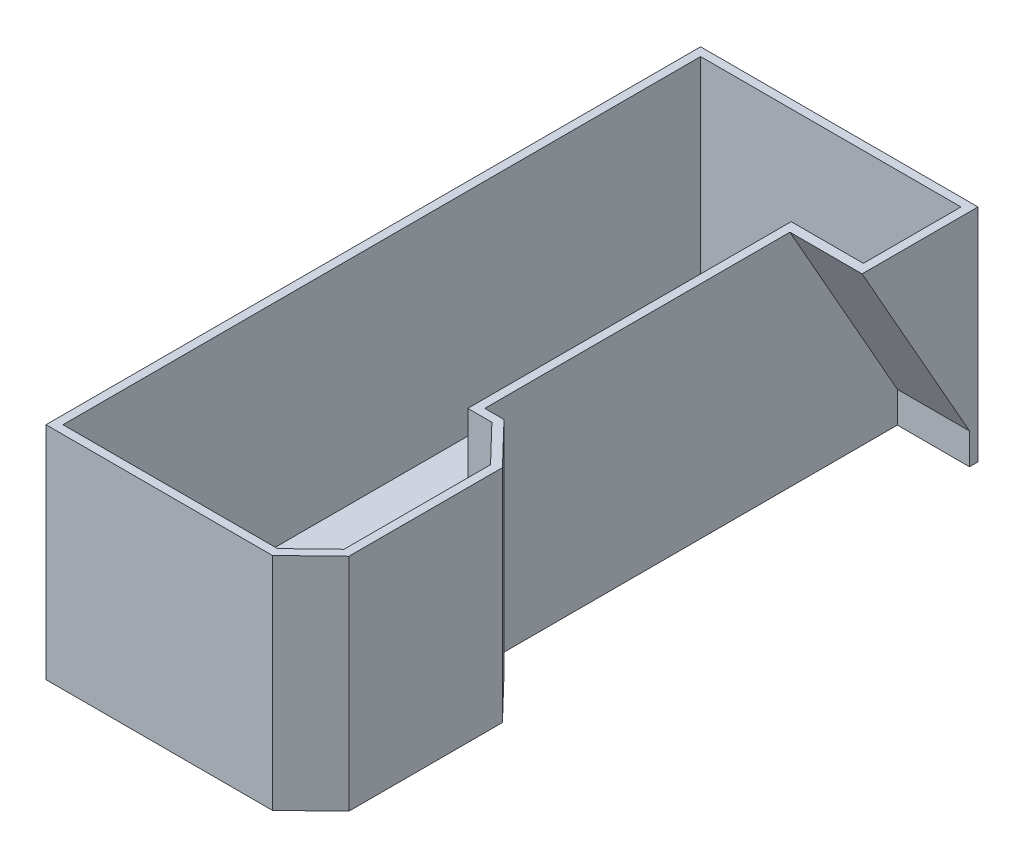
ISO-10303-21;
HEADER;
FILE_DESCRIPTION(('STEP AP214'),'2;1');
FILE_NAME('part.step','',(''),(''),'','','');
FILE_SCHEMA(('AUTOMOTIVE_DESIGN { 1 0 10303 214 1 1 1 1 }'));
ENDSEC;
DATA;
#1=APPLICATION_CONTEXT('core data for automotive mechanical design processes');
#2=APPLICATION_PROTOCOL_DEFINITION('international standard','automotive_design',2000,#1);
#3=PRODUCT_CONTEXT('',#1,'mechanical');
#4=PRODUCT('Part','Part','',(#3));
#5=PRODUCT_RELATED_PRODUCT_CATEGORY('part','',(#4));
#6=PRODUCT_DEFINITION_FORMATION('','',#4);
#7=PRODUCT_DEFINITION_CONTEXT('part definition',#1,'design');
#8=PRODUCT_DEFINITION('design','',#6,#7);
#9=PRODUCT_DEFINITION_SHAPE('','',#8);
#10=(LENGTH_UNIT() NAMED_UNIT(*) SI_UNIT(.MILLI.,.METRE.));
#11=(NAMED_UNIT(*) PLANE_ANGLE_UNIT() SI_UNIT($,.RADIAN.));
#12=(NAMED_UNIT(*) SI_UNIT($,.STERADIAN.) SOLID_ANGLE_UNIT());
#13=UNCERTAINTY_MEASURE_WITH_UNIT(LENGTH_MEASURE(1.E-05),#10,'distance_accuracy_value','');
#14=(GEOMETRIC_REPRESENTATION_CONTEXT(3) GLOBAL_UNCERTAINTY_ASSIGNED_CONTEXT((#13)) GLOBAL_UNIT_ASSIGNED_CONTEXT((#10,
#11,#12)) REPRESENTATION_CONTEXT('',''));
#15=CARTESIAN_POINT('',(0.,0.,0.));
#16=DIRECTION('',(0.,0.,1.));
#17=DIRECTION('',(1.,0.,0.));
#18=AXIS2_PLACEMENT_3D('',#15,#16,#17);
#19=CARTESIAN_POINT('',(290.,12.,0.));
#20=DIRECTION('',(-1.,0.,0.));
#21=DIRECTION('',(0.,0.,1.));
#22=AXIS2_PLACEMENT_3D('',#19,#20,#21);
#23=PLANE('',#22);
#24=DIRECTION('',(0.,-1.,0.));
#25=VECTOR('',#24,1.);
#26=CARTESIAN_POINT('',(290.,43.8393760342638,-913.));
#27=LINE('',#26,#25);
#28=CARTESIAN_POINT('',(290.,43.8393760342638,-913.));
#29=VERTEX_POINT('',#28);
#30=CARTESIAN_POINT('',(290.,0.,-913.));
#31=VERTEX_POINT('',#30);
#32=EDGE_CURVE('E189',#29,#31,#27,.T.);
#33=ORIENTED_EDGE('',*,*,#32,.F.);
#34=DIRECTION('',(0.,-0.87025685507146,-0.49259821985177));
#35=VECTOR('',#34,1.);
#36=CARTESIAN_POINT('',(290.,22.6393760342639,-925.));
#37=LINE('',#36,#35);
#38=CARTESIAN_POINT('',(290.,312.,-761.210967566564));
#39=VERTEX_POINT('',#38);
#40=EDGE_CURVE('E201',#39,#29,#37,.T.);
#41=ORIENTED_EDGE('',*,*,#40,.F.);
#42=DIRECTION('',(0.,0.,-1.));
#43=VECTOR('',#42,1.);
#44=CARTESIAN_POINT('',(290.,312.,-330.));
#45=LINE('',#44,#43);
#46=CARTESIAN_POINT('',(290.,312.,-330.));
#47=VERTEX_POINT('',#46);
#48=EDGE_CURVE('E298',#47,#39,#45,.T.);
#49=ORIENTED_EDGE('',*,*,#48,.F.);
#50=DIRECTION('',(0.,1.,0.));
#51=VECTOR('',#50,1.);
#52=CARTESIAN_POINT('',(290.,0.,-330.));
#53=LINE('',#52,#51);
#54=CARTESIAN_POINT('',(290.,0.,-330.));
#55=VERTEX_POINT('',#54);
#56=EDGE_CURVE('E313',#55,#47,#53,.T.);
#57=ORIENTED_EDGE('',*,*,#56,.F.);
#58=DIRECTION('',(0.,0.,-1.));
#59=VECTOR('',#58,1.);
#60=CARTESIAN_POINT('',(290.,0.,0.));
#61=LINE('',#60,#59);
#62=EDGE_CURVE('E204',#55,#31,#61,.T.);
#63=ORIENTED_EDGE('',*,*,#62,.T.);
#64=EDGE_LOOP('',(#33,#41,#49,#57,#63));
#65=FACE_BOUND('',#64,.T.);
#66=ADVANCED_FACE('F40',(#65),#23,.F.);
#67=CARTESIAN_POINT('',(380.,22.6393760342639,-925.));
#68=DIRECTION('',(0.,0.49259821985177,-0.87025685507146));
#69=DIRECTION('',(0.,0.87025685507146,0.49259821985177));
#70=AXIS2_PLACEMENT_3D('',#67,#68,#69);
#71=PLANE('',#70);
#72=DIRECTION('',(-1.,0.,0.));
#73=VECTOR('',#72,1.);
#74=CARTESIAN_POINT('',(437.45207246181,43.8393760342638,-913.));
#75=LINE('',#74,#73);
#76=CARTESIAN_POINT('',(392.,43.8393760342638,-913.));
#77=VERTEX_POINT('',#76);
#78=EDGE_CURVE('E185',#77,#29,#75,.T.);
#79=ORIENTED_EDGE('',*,*,#78,.F.);
#80=DIRECTION('',(0.,-0.87025685507146,-0.49259821985177));
#81=VECTOR('',#80,1.);
#82=CARTESIAN_POINT('',(392.,22.6393760342638,-925.));
#83=LINE('',#82,#81);
#84=CARTESIAN_POINT('',(392.,312.,-761.210967566564));
#85=VERTEX_POINT('',#84);
#86=EDGE_CURVE('E359',#85,#77,#83,.T.);
#87=ORIENTED_EDGE('',*,*,#86,.F.);
#88=DIRECTION('',(-1.,0.,0.));
#89=VECTOR('',#88,1.);
#90=CARTESIAN_POINT('',(380.,312.,-761.210967566564));
#91=LINE('',#90,#89);
#92=EDGE_CURVE('E207',#85,#39,#91,.T.);
#93=ORIENTED_EDGE('',*,*,#92,.T.);
#94=ORIENTED_EDGE('',*,*,#40,.T.);
#95=EDGE_LOOP('',(#79,#87,#93,#94));
#96=FACE_BOUND('',#95,.T.);
#97=ADVANCED_FACE('F206',(#96),#71,.F.);
#98=CARTESIAN_POINT('',(278.,312.,-775.));
#99=DIRECTION('',(0.,-0.49259821985177,0.87025685507146));
#100=DIRECTION('',(0.,-0.87025685507146,-0.49259821985177));
#101=AXIS2_PLACEMENT_3D('',#98,#99,#100);
#102=PLANE('',#101);
#103=DIRECTION('',(-1.,0.,0.));
#104=VECTOR('',#103,1.);
#105=CARTESIAN_POINT('',(380.,68.2,-913.));
#106=LINE('',#105,#104);
#107=CARTESIAN_POINT('',(380.,68.2,-913.));
#108=VERTEX_POINT('',#107);
#109=CARTESIAN_POINT('',(278.,68.2,-913.));
#110=VERTEX_POINT('',#109);
#111=EDGE_CURVE('E55',#108,#110,#106,.T.);
#112=ORIENTED_EDGE('',*,*,#111,.T.);
#113=DIRECTION('',(0.,-0.87025685507146,-0.49259821985177));
#114=VECTOR('',#113,1.);
#115=CARTESIAN_POINT('',(278.,312.,-775.));
#116=LINE('',#115,#114);
#117=CARTESIAN_POINT('',(278.,312.,-775.));
#118=VERTEX_POINT('',#117);
#119=EDGE_CURVE('E216',#118,#110,#116,.T.);
#120=ORIENTED_EDGE('',*,*,#119,.F.);
#121=DIRECTION('',(1.,0.,0.));
#122=VECTOR('',#121,1.);
#123=CARTESIAN_POINT('',(278.,312.,-775.));
#124=LINE('',#123,#122);
#125=CARTESIAN_POINT('',(380.,312.,-775.));
#126=VERTEX_POINT('',#125);
#127=EDGE_CURVE('E218',#118,#126,#124,.T.);
#128=ORIENTED_EDGE('',*,*,#127,.T.);
#129=DIRECTION('',(0.,0.87025685507146,0.49259821985177));
#130=VECTOR('',#129,1.);
#131=CARTESIAN_POINT('',(380.,312.,-775.));
#132=LINE('',#131,#130);
#133=EDGE_CURVE('E208',#108,#126,#132,.T.);
#134=ORIENTED_EDGE('',*,*,#133,.F.);
#135=EDGE_LOOP('',(#112,#120,#128,#134));
#136=FACE_BOUND('',#135,.T.);
#137=ADVANCED_FACE('F402',(#136),#102,.F.);
#138=CARTESIAN_POINT('',(0.,12.,0.));
#139=DIRECTION('',(1.,0.,0.));
#140=DIRECTION('',(0.,0.,-1.));
#141=AXIS2_PLACEMENT_3D('',#138,#139,#140);
#142=PLANE('',#141);
#143=DIRECTION('',(0.,0.,1.));
#144=VECTOR('',#143,1.);
#145=CARTESIAN_POINT('',(0.,0.,0.));
#146=LINE('',#145,#144);
#147=CARTESIAN_POINT('',(0.,0.,-925.));
#148=VERTEX_POINT('',#147);
#149=CARTESIAN_POINT('',(0.,0.,0.));
#150=VERTEX_POINT('',#149);
#151=EDGE_CURVE('E315',#148,#150,#146,.T.);
#152=ORIENTED_EDGE('',*,*,#151,.T.);
#153=DIRECTION('',(0.,-1.,0.));
#154=VECTOR('',#153,1.);
#155=CARTESIAN_POINT('',(0.,12.,0.));
#156=LINE('',#155,#154);
#157=CARTESIAN_POINT('',(0.,312.,0.));
#158=VERTEX_POINT('',#157);
#159=EDGE_CURVE('E11',#158,#150,#156,.T.);
#160=ORIENTED_EDGE('',*,*,#159,.F.);
#161=DIRECTION('',(0.,0.,1.));
#162=VECTOR('',#161,1.);
#163=CARTESIAN_POINT('',(0.,312.,-925.));
#164=LINE('',#163,#162);
#165=CARTESIAN_POINT('',(0.,312.,-925.));
#166=VERTEX_POINT('',#165);
#167=EDGE_CURVE('E280',#166,#158,#164,.T.);
#168=ORIENTED_EDGE('',*,*,#167,.F.);
#169=DIRECTION('',(0.,-1.,0.));
#170=VECTOR('',#169,1.);
#171=CARTESIAN_POINT('',(0.,12.,-925.));
#172=LINE('',#171,#170);
#173=EDGE_CURVE('E48',#166,#148,#172,.T.);
#174=ORIENTED_EDGE('',*,*,#173,.T.);
#175=EDGE_LOOP('',(#152,#160,#168,#174));
#176=FACE_BOUND('',#175,.T.);
#177=ADVANCED_FACE('F42',(#176),#142,.F.);
#178=CARTESIAN_POINT('',(0.,12.,0.));
#179=DIRECTION('',(0.,0.,-1.));
#180=DIRECTION('',(-1.,0.,0.));
#181=AXIS2_PLACEMENT_3D('',#178,#179,#180);
#182=PLANE('',#181);
#183=DIRECTION('',(1.,0.,0.));
#184=VECTOR('',#183,1.);
#185=CARTESIAN_POINT('',(0.,0.,0.));
#186=LINE('',#185,#184);
#187=CARTESIAN_POINT('',(320.,0.,0.));
#188=VERTEX_POINT('',#187);
#189=EDGE_CURVE('E325',#150,#188,#186,.T.);
#190=ORIENTED_EDGE('',*,*,#189,.T.);
#191=DIRECTION('',(0.,1.,0.));
#192=VECTOR('',#191,1.);
#193=CARTESIAN_POINT('',(320.,0.,0.));
#194=LINE('',#193,#192);
#195=CARTESIAN_POINT('',(320.,312.,0.));
#196=VERTEX_POINT('',#195);
#197=EDGE_CURVE('E312',#188,#196,#194,.T.);
#198=ORIENTED_EDGE('',*,*,#197,.T.);
#199=DIRECTION('',(1.,0.,0.));
#200=VECTOR('',#199,1.);
#201=CARTESIAN_POINT('',(0.,312.,0.));
#202=LINE('',#201,#200);
#203=EDGE_CURVE('E283',#158,#196,#202,.T.);
#204=ORIENTED_EDGE('',*,*,#203,.F.);
#205=ORIENTED_EDGE('',*,*,#159,.T.);
#206=EDGE_LOOP('',(#190,#198,#204,#205));
#207=FACE_BOUND('',#206,.T.);
#208=ADVANCED_FACE('F344',(#207),#182,.F.);
#209=CARTESIAN_POINT('',(0.,12.,-925.));
#210=DIRECTION('',(0.,0.,1.));
#211=DIRECTION('',(1.,0.,0.));
#212=AXIS2_PLACEMENT_3D('',#209,#210,#211);
#213=PLANE('',#212);
#214=DIRECTION('',(0.,1.,0.));
#215=VECTOR('',#214,1.);
#216=CARTESIAN_POINT('',(392.,312.,-925.));
#217=LINE('',#216,#215);
#218=CARTESIAN_POINT('',(392.,0.,-925.));
#219=VERTEX_POINT('',#218);
#220=CARTESIAN_POINT('',(392.,312.,-925.));
#221=VERTEX_POINT('',#220);
#222=EDGE_CURVE('E354',#219,#221,#217,.T.);
#223=ORIENTED_EDGE('',*,*,#222,.F.);
#224=DIRECTION('',(-1.,0.,0.));
#225=VECTOR('',#224,1.);
#226=CARTESIAN_POINT('',(0.,0.,-925.));
#227=LINE('',#226,#225);
#228=EDGE_CURVE('E328',#219,#148,#227,.T.);
#229=ORIENTED_EDGE('',*,*,#228,.T.);
#230=ORIENTED_EDGE('',*,*,#173,.F.);
#231=DIRECTION('',(-1.,0.,0.));
#232=VECTOR('',#231,1.);
#233=CARTESIAN_POINT('',(290.,312.,-925.));
#234=LINE('',#233,#232);
#235=EDGE_CURVE('E278',#221,#166,#234,.T.);
#236=ORIENTED_EDGE('',*,*,#235,.F.);
#237=EDGE_LOOP('',(#223,#229,#230,#236));
#238=FACE_BOUND('',#237,.T.);
#239=ADVANCED_FACE('F353',(#238),#213,.F.);
#240=CARTESIAN_POINT('',(0.,0.,0.));
#241=DIRECTION('',(0.,-1.,0.));
#242=DIRECTION('',(0.,0.,-1.));
#243=AXIS2_PLACEMENT_3D('',#240,#241,#242);
#244=PLANE('',#243);
#245=ORIENTED_EDGE('',*,*,#151,.F.);
#246=ORIENTED_EDGE('',*,*,#228,.F.);
#247=DIRECTION('',(0.,0.,1.));
#248=VECTOR('',#247,1.);
#249=CARTESIAN_POINT('',(392.,0.,-913.));
#250=LINE('',#249,#248);
#251=CARTESIAN_POINT('',(392.,0.,-913.));
#252=VERTEX_POINT('',#251);
#253=EDGE_CURVE('E358',#219,#252,#250,.T.);
#254=ORIENTED_EDGE('',*,*,#253,.T.);
#255=DIRECTION('',(-1.,0.,0.));
#256=VECTOR('',#255,1.);
#257=CARTESIAN_POINT('',(437.45207246181,0.,-913.));
#258=LINE('',#257,#256);
#259=EDGE_CURVE('E196',#252,#31,#258,.T.);
#260=ORIENTED_EDGE('',*,*,#259,.T.);
#261=ORIENTED_EDGE('',*,*,#62,.F.);
#262=DIRECTION('',(-1.,0.,0.));
#263=VECTOR('',#262,1.);
#264=CARTESIAN_POINT('',(290.,0.,-330.));
#265=LINE('',#264,#263);
#266=CARTESIAN_POINT('',(317.181818181818,0.,-330.));
#267=VERTEX_POINT('',#266);
#268=EDGE_CURVE('E309',#267,#55,#265,.T.);
#269=ORIENTED_EDGE('',*,*,#268,.F.);
#270=DIRECTION('',(-0.693893241040933,0.,-0.720077891646251));
#271=VECTOR('',#270,1.);
#272=CARTESIAN_POINT('',(317.181818181818,0.,-330.));
#273=LINE('',#272,#271);
#274=CARTESIAN_POINT('',(375.,0.,-270.));
#275=VERTEX_POINT('',#274);
#276=EDGE_CURVE('E306',#275,#267,#273,.T.);
#277=ORIENTED_EDGE('',*,*,#276,.F.);
#278=DIRECTION('',(0.,0.,-1.));
#279=VECTOR('',#278,1.);
#280=CARTESIAN_POINT('',(375.,0.,-270.));
#281=LINE('',#280,#279);
#282=CARTESIAN_POINT('',(375.,0.,-53.));
#283=VERTEX_POINT('',#282);
#284=EDGE_CURVE('E303',#283,#275,#281,.T.);
#285=ORIENTED_EDGE('',*,*,#284,.F.);
#286=DIRECTION('',(0.720077891646251,0.,-0.693893241040933));
#287=VECTOR('',#286,1.);
#288=CARTESIAN_POINT('',(375.,0.,-53.));
#289=LINE('',#288,#287);
#290=EDGE_CURVE('E300',#188,#283,#289,.T.);
#291=ORIENTED_EDGE('',*,*,#290,.F.);
#292=ORIENTED_EDGE('',*,*,#189,.F.);
#293=EDGE_LOOP('',(#245,#246,#254,#260,#261,#269,#277,#285,#291,#292));
#294=FACE_BOUND('',#293,.T.);
#295=ADVANCED_FACE('F336',(#294),#244,.T.);
#296=CARTESIAN_POINT('',(290.,0.,-330.));
#297=DIRECTION('',(0.,0.,-1.));
#298=DIRECTION('',(-1.,0.,0.));
#299=AXIS2_PLACEMENT_3D('',#296,#297,#298);
#300=PLANE('',#299);
#301=ORIENTED_EDGE('',*,*,#56,.T.);
#302=DIRECTION('',(-1.,0.,0.));
#303=VECTOR('',#302,1.);
#304=CARTESIAN_POINT('',(317.181818181818,312.,-330.));
#305=LINE('',#304,#303);
#306=CARTESIAN_POINT('',(317.181818181818,312.,-330.));
#307=VERTEX_POINT('',#306);
#308=EDGE_CURVE('E295',#307,#47,#305,.T.);
#309=ORIENTED_EDGE('',*,*,#308,.F.);
#310=DIRECTION('',(0.,1.,0.));
#311=VECTOR('',#310,1.);
#312=CARTESIAN_POINT('',(317.181818181818,0.,-330.));
#313=LINE('',#312,#311);
#314=EDGE_CURVE('E316',#267,#307,#313,.T.);
#315=ORIENTED_EDGE('',*,*,#314,.F.);
#316=ORIENTED_EDGE('',*,*,#268,.T.);
#317=EDGE_LOOP('',(#301,#309,#315,#316));
#318=FACE_BOUND('',#317,.T.);
#319=ADVANCED_FACE('F428',(#318),#300,.T.);
#320=CARTESIAN_POINT('',(317.181818181818,0.,-330.));
#321=DIRECTION('',(0.720077891646251,0.,-0.693893241040933));
#322=DIRECTION('',(-0.693893241040933,0.,-0.720077891646251));
#323=AXIS2_PLACEMENT_3D('',#320,#321,#322);
#324=PLANE('',#323);
#325=ORIENTED_EDGE('',*,*,#314,.T.);
#326=DIRECTION('',(-0.693893241040933,0.,-0.720077891646251));
#327=VECTOR('',#326,1.);
#328=CARTESIAN_POINT('',(375.,312.,-270.));
#329=LINE('',#328,#327);
#330=CARTESIAN_POINT('',(375.,312.,-270.));
#331=VERTEX_POINT('',#330);
#332=EDGE_CURVE('E292',#331,#307,#329,.T.);
#333=ORIENTED_EDGE('',*,*,#332,.F.);
#334=DIRECTION('',(0.,1.,0.));
#335=VECTOR('',#334,1.);
#336=CARTESIAN_POINT('',(375.,0.,-270.));
#337=LINE('',#336,#335);
#338=EDGE_CURVE('E318',#275,#331,#337,.T.);
#339=ORIENTED_EDGE('',*,*,#338,.F.);
#340=ORIENTED_EDGE('',*,*,#276,.T.);
#341=EDGE_LOOP('',(#325,#333,#339,#340));
#342=FACE_BOUND('',#341,.T.);
#343=ADVANCED_FACE('F432',(#342),#324,.T.);
#344=CARTESIAN_POINT('',(375.,0.,-270.));
#345=DIRECTION('',(1.,0.,0.));
#346=DIRECTION('',(0.,0.,-1.));
#347=AXIS2_PLACEMENT_3D('',#344,#345,#346);
#348=PLANE('',#347);
#349=ORIENTED_EDGE('',*,*,#338,.T.);
#350=DIRECTION('',(0.,0.,-1.));
#351=VECTOR('',#350,1.);
#352=CARTESIAN_POINT('',(375.,312.,-53.));
#353=LINE('',#352,#351);
#354=CARTESIAN_POINT('',(375.,312.,-53.));
#355=VERTEX_POINT('',#354);
#356=EDGE_CURVE('E289',#355,#331,#353,.T.);
#357=ORIENTED_EDGE('',*,*,#356,.F.);
#358=DIRECTION('',(0.,1.,0.));
#359=VECTOR('',#358,1.);
#360=CARTESIAN_POINT('',(375.,0.,-53.));
#361=LINE('',#360,#359);
#362=EDGE_CURVE('E320',#283,#355,#361,.T.);
#363=ORIENTED_EDGE('',*,*,#362,.F.);
#364=ORIENTED_EDGE('',*,*,#284,.T.);
#365=EDGE_LOOP('',(#349,#357,#363,#364));
#366=FACE_BOUND('',#365,.T.);
#367=ADVANCED_FACE('F441',(#366),#348,.T.);
#368=CARTESIAN_POINT('',(375.,0.,-53.));
#369=DIRECTION('',(0.693893241040933,0.,0.720077891646251));
#370=DIRECTION('',(0.720077891646251,0.,-0.693893241040933));
#371=AXIS2_PLACEMENT_3D('',#368,#369,#370);
#372=PLANE('',#371);
#373=ORIENTED_EDGE('',*,*,#362,.T.);
#374=DIRECTION('',(0.720077891646251,0.,-0.693893241040933));
#375=VECTOR('',#374,1.);
#376=CARTESIAN_POINT('',(320.,312.,0.));
#377=LINE('',#376,#375);
#378=EDGE_CURVE('E286',#196,#355,#377,.T.);
#379=ORIENTED_EDGE('',*,*,#378,.F.);
#380=ORIENTED_EDGE('',*,*,#197,.F.);
#381=ORIENTED_EDGE('',*,*,#290,.T.);
#382=EDGE_LOOP('',(#373,#379,#380,#381));
#383=FACE_BOUND('',#382,.T.);
#384=ADVANCED_FACE('F438',(#383),#372,.T.);
#385=CARTESIAN_POINT('',(0.,312.,0.));
#386=DIRECTION('',(0.,1.,0.));
#387=DIRECTION('',(0.,0.,1.));
#388=AXIS2_PLACEMENT_3D('',#385,#386,#387);
#389=PLANE('',#388);
#390=ORIENTED_EDGE('',*,*,#92,.F.);
#391=DIRECTION('',(0.,0.,1.));
#392=VECTOR('',#391,1.);
#393=CARTESIAN_POINT('',(392.,312.,-761.210967566564));
#394=LINE('',#393,#392);
#395=EDGE_CURVE('E351',#221,#85,#394,.T.);
#396=ORIENTED_EDGE('',*,*,#395,.F.);
#397=ORIENTED_EDGE('',*,*,#235,.T.);
#398=ORIENTED_EDGE('',*,*,#167,.T.);
#399=ORIENTED_EDGE('',*,*,#203,.T.);
#400=ORIENTED_EDGE('',*,*,#378,.T.);
#401=ORIENTED_EDGE('',*,*,#356,.T.);
#402=ORIENTED_EDGE('',*,*,#332,.T.);
#403=ORIENTED_EDGE('',*,*,#308,.T.);
#404=ORIENTED_EDGE('',*,*,#48,.T.);
#405=EDGE_LOOP('',(#390,#396,#397,#398,#399,#400,#401,#402,#403,#404));
#406=FACE_BOUND('',#405,.T.);
#407=ORIENTED_EDGE('',*,*,#127,.F.);
#408=DIRECTION('',(0.,0.,-1.));
#409=VECTOR('',#408,1.);
#410=CARTESIAN_POINT('',(278.,312.,-318.));
#411=LINE('',#410,#409);
#412=CARTESIAN_POINT('',(278.,312.,-318.));
#413=VERTEX_POINT('',#412);
#414=EDGE_CURVE('E237',#413,#118,#411,.T.);
#415=ORIENTED_EDGE('',*,*,#414,.F.);
#416=DIRECTION('',(-1.,0.,0.));
#417=VECTOR('',#416,1.);
#418=CARTESIAN_POINT('',(312.080590731117,312.,-318.));
#419=LINE('',#418,#417);
#420=CARTESIAN_POINT('',(312.080590731117,312.,-318.));
#421=VERTEX_POINT('',#420);
#422=EDGE_CURVE('E234',#421,#413,#419,.T.);
#423=ORIENTED_EDGE('',*,*,#422,.F.);
#424=DIRECTION('',(-0.693893241040933,0.,-0.720077891646251));
#425=VECTOR('',#424,1.);
#426=CARTESIAN_POINT('',(363.,312.,-265.159103588895));
#427=LINE('',#426,#425);
#428=CARTESIAN_POINT('',(363.,312.,-265.159103588895));
#429=VERTEX_POINT('',#428);
#430=EDGE_CURVE('E232',#429,#421,#427,.T.);
#431=ORIENTED_EDGE('',*,*,#430,.F.);
#432=DIRECTION('',(0.,0.,-1.));
#433=VECTOR('',#432,1.);
#434=CARTESIAN_POINT('',(363.,312.,-58.1012274507011));
#435=LINE('',#434,#433);
#436=CARTESIAN_POINT('',(363.,312.,-58.1012274507011));
#437=VERTEX_POINT('',#436);
#438=EDGE_CURVE('E230',#437,#429,#435,.T.);
#439=ORIENTED_EDGE('',*,*,#438,.F.);
#440=DIRECTION('',(0.720077891646251,0.,-0.693893241040933));
#441=VECTOR('',#440,1.);
#442=CARTESIAN_POINT('',(315.159103588895,312.,-12.));
#443=LINE('',#442,#441);
#444=CARTESIAN_POINT('',(315.159103588895,312.,-12.));
#445=VERTEX_POINT('',#444);
#446=EDGE_CURVE('E228',#445,#437,#443,.T.);
#447=ORIENTED_EDGE('',*,*,#446,.F.);
#448=DIRECTION('',(1.,0.,0.));
#449=VECTOR('',#448,1.);
#450=CARTESIAN_POINT('',(12.,312.,-12.));
#451=LINE('',#450,#449);
#452=CARTESIAN_POINT('',(12.,312.,-12.));
#453=VERTEX_POINT('',#452);
#454=EDGE_CURVE('E226',#453,#445,#451,.T.);
#455=ORIENTED_EDGE('',*,*,#454,.F.);
#456=DIRECTION('',(0.,0.,1.));
#457=VECTOR('',#456,1.);
#458=CARTESIAN_POINT('',(12.,312.,-913.));
#459=LINE('',#458,#457);
#460=CARTESIAN_POINT('',(12.,312.,-913.));
#461=VERTEX_POINT('',#460);
#462=EDGE_CURVE('E223',#461,#453,#459,.T.);
#463=ORIENTED_EDGE('',*,*,#462,.F.);
#464=DIRECTION('',(-1.,0.,0.));
#465=VECTOR('',#464,1.);
#466=CARTESIAN_POINT('',(278.,312.,-913.));
#467=LINE('',#466,#465);
#468=CARTESIAN_POINT('',(380.,312.,-913.));
#469=VERTEX_POINT('',#468);
#470=EDGE_CURVE('E221',#469,#461,#467,.T.);
#471=ORIENTED_EDGE('',*,*,#470,.F.);
#472=DIRECTION('',(0.,0.,1.));
#473=VECTOR('',#472,1.);
#474=CARTESIAN_POINT('',(380.,312.,-761.210967566564));
#475=LINE('',#474,#473);
#476=EDGE_CURVE('E362',#469,#126,#475,.T.);
#477=ORIENTED_EDGE('',*,*,#476,.T.);
#478=EDGE_LOOP('',(#407,#415,#423,#431,#439,#447,#455,#463,#471,#477));
#479=FACE_BOUND('',#478,.T.);
#480=ADVANCED_FACE('F346',(#406,#479),#389,.T.);
#481=CARTESIAN_POINT('',(278.,312.,-913.));
#482=DIRECTION('',(0.,0.,1.));
#483=DIRECTION('',(1.,0.,0.));
#484=AXIS2_PLACEMENT_3D('',#481,#482,#483);
#485=PLANE('',#484);
#486=DIRECTION('',(-1.,0.,0.));
#487=VECTOR('',#486,1.);
#488=CARTESIAN_POINT('',(278.,12.,-913.));
#489=LINE('',#488,#487);
#490=CARTESIAN_POINT('',(278.,12.,-913.));
#491=VERTEX_POINT('',#490);
#492=CARTESIAN_POINT('',(12.,12.,-913.));
#493=VERTEX_POINT('',#492);
#494=EDGE_CURVE('E220',#491,#493,#489,.T.);
#495=ORIENTED_EDGE('',*,*,#494,.F.);
#496=DIRECTION('',(0.,-1.,0.));
#497=VECTOR('',#496,1.);
#498=CARTESIAN_POINT('',(278.,312.,-913.));
#499=LINE('',#498,#497);
#500=EDGE_CURVE('E62',#110,#491,#499,.T.);
#501=ORIENTED_EDGE('',*,*,#500,.F.);
#502=ORIENTED_EDGE('',*,*,#111,.F.);
#503=DIRECTION('',(0.,-1.,0.));
#504=VECTOR('',#503,1.);
#505=CARTESIAN_POINT('',(380.,68.2,-913.));
#506=LINE('',#505,#504);
#507=EDGE_CURVE('E212',#469,#108,#506,.T.);
#508=ORIENTED_EDGE('',*,*,#507,.F.);
#509=ORIENTED_EDGE('',*,*,#470,.T.);
#510=DIRECTION('',(0.,-1.,0.));
#511=VECTOR('',#510,1.);
#512=CARTESIAN_POINT('',(12.,312.,-913.));
#513=LINE('',#512,#511);
#514=EDGE_CURVE('E275',#461,#493,#513,.T.);
#515=ORIENTED_EDGE('',*,*,#514,.T.);
#516=EDGE_LOOP('',(#495,#501,#502,#508,#509,#515));
#517=FACE_BOUND('',#516,.T.);
#518=ADVANCED_FACE('F372',(#517),#485,.T.);
#519=CARTESIAN_POINT('',(12.,312.,-913.));
#520=DIRECTION('',(1.,0.,0.));
#521=DIRECTION('',(0.,0.,-1.));
#522=AXIS2_PLACEMENT_3D('',#519,#520,#521);
#523=PLANE('',#522);
#524=DIRECTION('',(0.,0.,1.));
#525=VECTOR('',#524,1.);
#526=CARTESIAN_POINT('',(12.,12.,-913.));
#527=LINE('',#526,#525);
#528=CARTESIAN_POINT('',(12.,12.,-12.));
#529=VERTEX_POINT('',#528);
#530=EDGE_CURVE('E242',#493,#529,#527,.T.);
#531=ORIENTED_EDGE('',*,*,#530,.F.);
#532=ORIENTED_EDGE('',*,*,#514,.F.);
#533=ORIENTED_EDGE('',*,*,#462,.T.);
#534=DIRECTION('',(0.,-1.,0.));
#535=VECTOR('',#534,1.);
#536=CARTESIAN_POINT('',(12.,312.,-12.));
#537=LINE('',#536,#535);
#538=EDGE_CURVE('E273',#453,#529,#537,.T.);
#539=ORIENTED_EDGE('',*,*,#538,.T.);
#540=EDGE_LOOP('',(#531,#532,#533,#539));
#541=FACE_BOUND('',#540,.T.);
#542=ADVANCED_FACE('F376',(#541),#523,.T.);
#543=CARTESIAN_POINT('',(12.,312.,-12.));
#544=DIRECTION('',(0.,0.,-1.));
#545=DIRECTION('',(-1.,0.,0.));
#546=AXIS2_PLACEMENT_3D('',#543,#544,#545);
#547=PLANE('',#546);
#548=DIRECTION('',(1.,0.,0.));
#549=VECTOR('',#548,1.);
#550=CARTESIAN_POINT('',(12.,12.,-12.));
#551=LINE('',#550,#549);
#552=CARTESIAN_POINT('',(315.159103588895,12.,-12.));
#553=VERTEX_POINT('',#552);
#554=EDGE_CURVE('E245',#529,#553,#551,.T.);
#555=ORIENTED_EDGE('',*,*,#554,.F.);
#556=ORIENTED_EDGE('',*,*,#538,.F.);
#557=ORIENTED_EDGE('',*,*,#454,.T.);
#558=DIRECTION('',(0.,-1.,0.));
#559=VECTOR('',#558,1.);
#560=CARTESIAN_POINT('',(315.159103588895,312.,-12.));
#561=LINE('',#560,#559);
#562=EDGE_CURVE('E271',#445,#553,#561,.T.);
#563=ORIENTED_EDGE('',*,*,#562,.T.);
#564=EDGE_LOOP('',(#555,#556,#557,#563));
#565=FACE_BOUND('',#564,.T.);
#566=ADVANCED_FACE('F385',(#565),#547,.T.);
#567=CARTESIAN_POINT('',(315.159103588895,312.,-12.));
#568=DIRECTION('',(-0.693893241040933,0.,-0.720077891646251));
#569=DIRECTION('',(-0.720077891646251,0.,0.693893241040933));
#570=AXIS2_PLACEMENT_3D('',#567,#568,#569);
#571=PLANE('',#570);
#572=DIRECTION('',(0.720077891646251,0.,-0.693893241040933));
#573=VECTOR('',#572,1.);
#574=CARTESIAN_POINT('',(315.159103588895,12.,-12.));
#575=LINE('',#574,#573);
#576=CARTESIAN_POINT('',(363.,12.,-58.1012274507011));
#577=VERTEX_POINT('',#576);
#578=EDGE_CURVE('E248',#553,#577,#575,.T.);
#579=ORIENTED_EDGE('',*,*,#578,.F.);
#580=ORIENTED_EDGE('',*,*,#562,.F.);
#581=ORIENTED_EDGE('',*,*,#446,.T.);
#582=DIRECTION('',(0.,-1.,0.));
#583=VECTOR('',#582,1.);
#584=CARTESIAN_POINT('',(363.,312.,-58.1012274507011));
#585=LINE('',#584,#583);
#586=EDGE_CURVE('E269',#437,#577,#585,.T.);
#587=ORIENTED_EDGE('',*,*,#586,.T.);
#588=EDGE_LOOP('',(#579,#580,#581,#587));
#589=FACE_BOUND('',#588,.T.);
#590=ADVANCED_FACE('F388',(#589),#571,.T.);
#591=CARTESIAN_POINT('',(363.,312.,-58.1012274507011));
#592=DIRECTION('',(-1.,0.,0.));
#593=DIRECTION('',(0.,0.,1.));
#594=AXIS2_PLACEMENT_3D('',#591,#592,#593);
#595=PLANE('',#594);
#596=DIRECTION('',(0.,0.,-1.));
#597=VECTOR('',#596,1.);
#598=CARTESIAN_POINT('',(363.,12.,-58.1012274507011));
#599=LINE('',#598,#597);
#600=CARTESIAN_POINT('',(363.,12.,-265.159103588895));
#601=VERTEX_POINT('',#600);
#602=EDGE_CURVE('E251',#577,#601,#599,.T.);
#603=ORIENTED_EDGE('',*,*,#602,.F.);
#604=ORIENTED_EDGE('',*,*,#586,.F.);
#605=ORIENTED_EDGE('',*,*,#438,.T.);
#606=DIRECTION('',(0.,-1.,0.));
#607=VECTOR('',#606,1.);
#608=CARTESIAN_POINT('',(363.,312.,-265.159103588895));
#609=LINE('',#608,#607);
#610=EDGE_CURVE('E267',#429,#601,#609,.T.);
#611=ORIENTED_EDGE('',*,*,#610,.T.);
#612=EDGE_LOOP('',(#603,#604,#605,#611));
#613=FACE_BOUND('',#612,.T.);
#614=ADVANCED_FACE('F458',(#613),#595,.T.);
#615=CARTESIAN_POINT('',(363.,312.,-265.159103588895));
#616=DIRECTION('',(-0.720077891646251,0.,0.693893241040933));
#617=DIRECTION('',(0.693893241040933,0.,0.720077891646251));
#618=AXIS2_PLACEMENT_3D('',#615,#616,#617);
#619=PLANE('',#618);
#620=DIRECTION('',(-0.693893241040933,0.,-0.720077891646251));
#621=VECTOR('',#620,1.);
#622=CARTESIAN_POINT('',(363.,12.,-265.159103588895));
#623=LINE('',#622,#621);
#624=CARTESIAN_POINT('',(312.080590731117,12.,-318.));
#625=VERTEX_POINT('',#624);
#626=EDGE_CURVE('E254',#601,#625,#623,.T.);
#627=ORIENTED_EDGE('',*,*,#626,.F.);
#628=ORIENTED_EDGE('',*,*,#610,.F.);
#629=ORIENTED_EDGE('',*,*,#430,.T.);
#630=DIRECTION('',(0.,-1.,0.));
#631=VECTOR('',#630,1.);
#632=CARTESIAN_POINT('',(312.080590731117,312.,-318.));
#633=LINE('',#632,#631);
#634=EDGE_CURVE('E265',#421,#625,#633,.T.);
#635=ORIENTED_EDGE('',*,*,#634,.T.);
#636=EDGE_LOOP('',(#627,#628,#629,#635));
#637=FACE_BOUND('',#636,.T.);
#638=ADVANCED_FACE('F461',(#637),#619,.T.);
#639=CARTESIAN_POINT('',(312.080590731117,312.,-318.));
#640=DIRECTION('',(0.,0.,1.));
#641=DIRECTION('',(1.,0.,0.));
#642=AXIS2_PLACEMENT_3D('',#639,#640,#641);
#643=PLANE('',#642);
#644=DIRECTION('',(-1.,0.,0.));
#645=VECTOR('',#644,1.);
#646=CARTESIAN_POINT('',(312.080590731117,12.,-318.));
#647=LINE('',#646,#645);
#648=CARTESIAN_POINT('',(278.,12.,-318.));
#649=VERTEX_POINT('',#648);
#650=EDGE_CURVE('E257',#625,#649,#647,.T.);
#651=ORIENTED_EDGE('',*,*,#650,.F.);
#652=ORIENTED_EDGE('',*,*,#634,.F.);
#653=ORIENTED_EDGE('',*,*,#422,.T.);
#654=DIRECTION('',(0.,-1.,0.));
#655=VECTOR('',#654,1.);
#656=CARTESIAN_POINT('',(278.,312.,-318.));
#657=LINE('',#656,#655);
#658=EDGE_CURVE('E263',#413,#649,#657,.T.);
#659=ORIENTED_EDGE('',*,*,#658,.T.);
#660=EDGE_LOOP('',(#651,#652,#653,#659));
#661=FACE_BOUND('',#660,.T.);
#662=ADVANCED_FACE('F399',(#661),#643,.T.);
#663=CARTESIAN_POINT('',(278.,312.,-318.));
#664=DIRECTION('',(-1.,0.,0.));
#665=DIRECTION('',(0.,0.,1.));
#666=AXIS2_PLACEMENT_3D('',#663,#664,#665);
#667=PLANE('',#666);
#668=ORIENTED_EDGE('',*,*,#119,.T.);
#669=ORIENTED_EDGE('',*,*,#500,.T.);
#670=DIRECTION('',(0.,0.,-1.));
#671=VECTOR('',#670,1.);
#672=CARTESIAN_POINT('',(278.,12.,-318.));
#673=LINE('',#672,#671);
#674=EDGE_CURVE('E224',#649,#491,#673,.T.);
#675=ORIENTED_EDGE('',*,*,#674,.F.);
#676=ORIENTED_EDGE('',*,*,#658,.F.);
#677=ORIENTED_EDGE('',*,*,#414,.T.);
#678=EDGE_LOOP('',(#668,#669,#675,#676,#677));
#679=FACE_BOUND('',#678,.T.);
#680=ADVANCED_FACE('F394',(#679),#667,.T.);
#681=CARTESIAN_POINT('',(0.,12.,0.));
#682=DIRECTION('',(0.,-1.,0.));
#683=DIRECTION('',(0.,0.,-1.));
#684=AXIS2_PLACEMENT_3D('',#681,#682,#683);
#685=PLANE('',#684);
#686=ORIENTED_EDGE('',*,*,#674,.T.);
#687=ORIENTED_EDGE('',*,*,#494,.T.);
#688=ORIENTED_EDGE('',*,*,#530,.T.);
#689=ORIENTED_EDGE('',*,*,#554,.T.);
#690=ORIENTED_EDGE('',*,*,#578,.T.);
#691=ORIENTED_EDGE('',*,*,#602,.T.);
#692=ORIENTED_EDGE('',*,*,#626,.T.);
#693=ORIENTED_EDGE('',*,*,#650,.T.);
#694=EDGE_LOOP('',(#686,#687,#688,#689,#690,#691,#692,#693));
#695=FACE_BOUND('',#694,.T.);
#696=ADVANCED_FACE('F392',(#695),#685,.F.);
#697=CARTESIAN_POINT('',(392.,0.,0.));
#698=DIRECTION('',(-1.,0.,0.));
#699=DIRECTION('',(0.,0.,1.));
#700=AXIS2_PLACEMENT_3D('',#697,#698,#699);
#701=PLANE('',#700);
#702=ORIENTED_EDGE('',*,*,#86,.T.);
#703=DIRECTION('',(0.,1.,0.));
#704=VECTOR('',#703,1.);
#705=CARTESIAN_POINT('',(392.,43.8393760342638,-913.));
#706=LINE('',#705,#704);
#707=EDGE_CURVE('E191',#252,#77,#706,.T.);
#708=ORIENTED_EDGE('',*,*,#707,.F.);
#709=ORIENTED_EDGE('',*,*,#253,.F.);
#710=ORIENTED_EDGE('',*,*,#222,.T.);
#711=ORIENTED_EDGE('',*,*,#395,.T.);
#712=EDGE_LOOP('',(#702,#708,#709,#710,#711));
#713=FACE_BOUND('',#712,.T.);
#714=ADVANCED_FACE('F357',(#713),#701,.F.);
#715=CARTESIAN_POINT('',(380.,0.,0.));
#716=DIRECTION('',(-1.,0.,0.));
#717=DIRECTION('',(0.,0.,1.));
#718=AXIS2_PLACEMENT_3D('',#715,#716,#717);
#719=PLANE('',#718);
#720=ORIENTED_EDGE('',*,*,#476,.F.);
#721=ORIENTED_EDGE('',*,*,#507,.T.);
#722=ORIENTED_EDGE('',*,*,#133,.T.);
#723=EDGE_LOOP('',(#720,#721,#722));
#724=FACE_BOUND('',#723,.T.);
#725=ADVANCED_FACE('F371',(#724),#719,.T.);
#726=CARTESIAN_POINT('',(437.45207246181,43.8393760342638,-913.));
#727=DIRECTION('',(0.,0.,-1.));
#728=DIRECTION('',(-1.,0.,0.));
#729=AXIS2_PLACEMENT_3D('',#726,#727,#728);
#730=PLANE('',#729);
#731=ORIENTED_EDGE('',*,*,#259,.F.);
#732=ORIENTED_EDGE('',*,*,#707,.T.);
#733=ORIENTED_EDGE('',*,*,#78,.T.);
#734=ORIENTED_EDGE('',*,*,#32,.T.);
#735=EDGE_LOOP('',(#731,#732,#733,#734));
#736=FACE_BOUND('',#735,.T.);
#737=ADVANCED_FACE('F188',(#736),#730,.F.);
#738=CLOSED_SHELL('',(#66,#97,#137,#177,#208,#239,#295,#319,#343,#367,#384,#480,#518,#542,#566,
#590,#614,#638,#662,#680,#696,#714,#725,#737));
#739=MANIFOLD_SOLID_BREP('B2',#738);
#740=ADVANCED_BREP_SHAPE_REPRESENTATION('',(#18,#739),#14);
#741=SHAPE_DEFINITION_REPRESENTATION(#9,#740);
ENDSEC;
END-ISO-10303-21;
